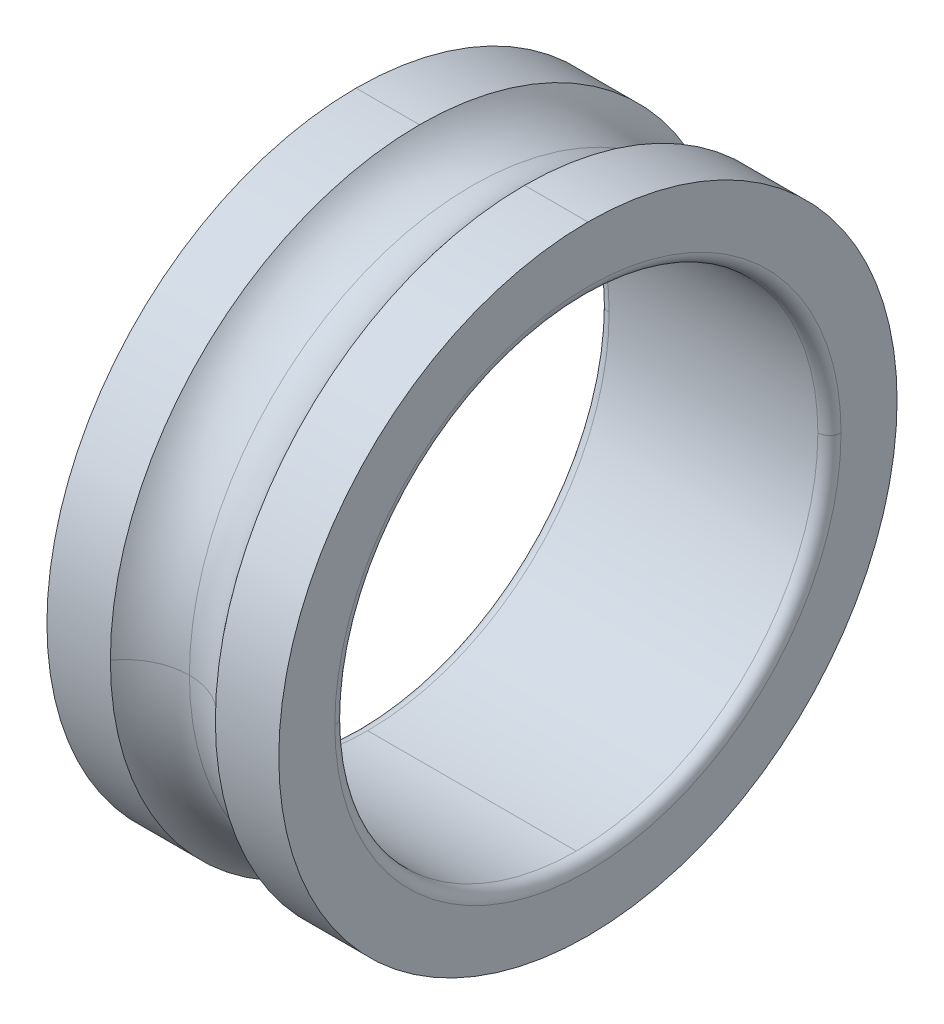
ISO-10303-21;
HEADER;
FILE_DESCRIPTION(('STEP AP214'),'2;1');
FILE_NAME('part.step','',(''),(''),'','','');
FILE_SCHEMA(('AUTOMOTIVE_DESIGN { 1 0 10303 214 1 1 1 1 }'));
ENDSEC;
DATA;
#1=APPLICATION_CONTEXT('core data for automotive mechanical design processes');
#2=APPLICATION_PROTOCOL_DEFINITION('international standard','automotive_design',2000,#1);
#3=PRODUCT_CONTEXT('',#1,'mechanical');
#4=PRODUCT('Part','Part','',(#3));
#5=PRODUCT_RELATED_PRODUCT_CATEGORY('part','',(#4));
#6=PRODUCT_DEFINITION_FORMATION('','',#4);
#7=PRODUCT_DEFINITION_CONTEXT('part definition',#1,'design');
#8=PRODUCT_DEFINITION('design','',#6,#7);
#9=PRODUCT_DEFINITION_SHAPE('','',#8);
#10=(LENGTH_UNIT() NAMED_UNIT(*) SI_UNIT(.MILLI.,.METRE.));
#11=(NAMED_UNIT(*) PLANE_ANGLE_UNIT() SI_UNIT($,.RADIAN.));
#12=(NAMED_UNIT(*) SI_UNIT($,.STERADIAN.) SOLID_ANGLE_UNIT());
#13=UNCERTAINTY_MEASURE_WITH_UNIT(LENGTH_MEASURE(1.E-05),#10,'distance_accuracy_value','');
#14=(GEOMETRIC_REPRESENTATION_CONTEXT(3) GLOBAL_UNCERTAINTY_ASSIGNED_CONTEXT((#13)) GLOBAL_UNIT_ASSIGNED_CONTEXT((#10,
#11,#12)) REPRESENTATION_CONTEXT('',''));
#15=CARTESIAN_POINT('',(0.,0.,0.));
#16=DIRECTION('',(0.,0.,1.));
#17=DIRECTION('',(1.,0.,0.));
#18=AXIS2_PLACEMENT_3D('',#15,#16,#17);
#19=CARTESIAN_POINT('',(10.3583539901292,0.,0.));
#20=DIRECTION('',(1.,0.,0.));
#21=DIRECTION('',(0.,1.,0.));
#22=AXIS2_PLACEMENT_3D('',#19,#20,#21);
#23=CYLINDRICAL_SURFACE('',#22,16.);
#24=DIRECTION('',(1.,0.,0.));
#25=VECTOR('',#24,1.);
#26=CARTESIAN_POINT('',(10.3583539901292,16.,0.));
#27=LINE('',#26,#25);
#28=CARTESIAN_POINT('',(8.71670798025846,16.,0.));
#29=VERTEX_POINT('',#28);
#30=CARTESIAN_POINT('',(12.,16.,0.));
#31=VERTEX_POINT('',#30);
#32=EDGE_CURVE('E159',#29,#31,#27,.T.);
#33=ORIENTED_EDGE('',*,*,#32,.T.);
#34=CARTESIAN_POINT('',(12.,0.,0.));
#35=DIRECTION('',(1.,0.,0.));
#36=DIRECTION('',(0.,1.,0.));
#37=AXIS2_PLACEMENT_3D('',#34,#35,#36);
#38=CIRCLE('',#37,16.);
#39=CARTESIAN_POINT('',(12.,-16.,0.));
#40=VERTEX_POINT('',#39);
#41=EDGE_CURVE('E167',#40,#31,#38,.T.);
#42=ORIENTED_EDGE('',*,*,#41,.F.);
#43=DIRECTION('',(-1.,0.,0.));
#44=VECTOR('',#43,1.);
#45=CARTESIAN_POINT('',(10.3583539901292,-16.,0.));
#46=LINE('',#45,#44);
#47=CARTESIAN_POINT('',(8.71670798025846,-16.,0.));
#48=VERTEX_POINT('',#47);
#49=EDGE_CURVE('E165',#40,#48,#46,.T.);
#50=ORIENTED_EDGE('',*,*,#49,.T.);
#51=CARTESIAN_POINT('',(8.71670798025846,0.,0.));
#52=DIRECTION('',(1.,0.,0.));
#53=DIRECTION('',(0.,1.,0.));
#54=AXIS2_PLACEMENT_3D('',#51,#52,#53);
#55=CIRCLE('',#54,16.);
#56=CARTESIAN_POINT('',(8.71670798025846,0.,-16.));
#57=VERTEX_POINT('',#56);
#58=EDGE_CURVE('E135',#48,#57,#55,.T.);
#59=ORIENTED_EDGE('',*,*,#58,.T.);
#60=CARTESIAN_POINT('',(8.71670798025846,0.,0.));
#61=DIRECTION('',(1.,0.,0.));
#62=DIRECTION('',(0.,1.,0.));
#63=AXIS2_PLACEMENT_3D('',#60,#61,#62);
#64=CIRCLE('',#63,16.);
#65=EDGE_CURVE('E157',#57,#29,#64,.T.);
#66=ORIENTED_EDGE('',*,*,#65,.T.);
#67=EDGE_LOOP('',(#33,#42,#50,#59,#66));
#68=FACE_BOUND('',#67,.T.);
#69=ADVANCED_FACE('F19',(#68),#23,.T.);
#70=CARTESIAN_POINT('',(6.,0.,0.));
#71=DIRECTION('',(1.,0.,0.));
#72=DIRECTION('',(0.,0.,-1.));
#73=AXIS2_PLACEMENT_3D('',#70,#71,#72);
#74=TOROIDAL_SURFACE('',#73,18.,3.3735);
#75=CARTESIAN_POINT('',(6.,0.,0.));
#76=DIRECTION('',(-1.,0.,0.));
#77=DIRECTION('',(0.,0.,1.));
#78=AXIS2_PLACEMENT_3D('',#75,#76,#77);
#79=CIRCLE('',#78,14.6265);
#80=CARTESIAN_POINT('',(6.,0.,14.6265));
#81=VERTEX_POINT('',#80);
#82=CARTESIAN_POINT('',(6.,0.,-14.6265));
#83=VERTEX_POINT('',#82);
#84=EDGE_CURVE('E117',#81,#83,#79,.T.);
#85=ORIENTED_EDGE('',*,*,#84,.T.);
#86=CARTESIAN_POINT('',(6.,0.,-18.));
#87=DIRECTION('',(0.,-1.,0.));
#88=DIRECTION('',(0.,0.,-1.));
#89=AXIS2_PLACEMENT_3D('',#86,#87,#88);
#90=CIRCLE('',#89,3.3735);
#91=CARTESIAN_POINT('',(3.28329201974154,0.,-16.));
#92=VERTEX_POINT('',#91);
#93=EDGE_CURVE('E131',#83,#92,#90,.T.);
#94=ORIENTED_EDGE('',*,*,#93,.T.);
#95=CARTESIAN_POINT('',(3.28329201974154,0.,0.));
#96=DIRECTION('',(1.,0.,0.));
#97=DIRECTION('',(0.,1.,0.));
#98=AXIS2_PLACEMENT_3D('',#95,#96,#97);
#99=CIRCLE('',#98,16.);
#100=CARTESIAN_POINT('',(3.28329201974154,16.,0.));
#101=VERTEX_POINT('',#100);
#102=EDGE_CURVE('E11',#92,#101,#99,.T.);
#103=ORIENTED_EDGE('',*,*,#102,.T.);
#104=CARTESIAN_POINT('',(3.28329201974154,0.,0.));
#105=DIRECTION('',(1.,0.,0.));
#106=DIRECTION('',(0.,1.,0.));
#107=AXIS2_PLACEMENT_3D('',#104,#105,#106);
#108=CIRCLE('',#107,16.);
#109=CARTESIAN_POINT('',(3.28329201974154,0.,16.));
#110=VERTEX_POINT('',#109);
#111=EDGE_CURVE('E119',#101,#110,#108,.T.);
#112=ORIENTED_EDGE('',*,*,#111,.T.);
#113=CARTESIAN_POINT('',(6.,0.,18.));
#114=DIRECTION('',(0.,-1.,0.));
#115=DIRECTION('',(0.,0.,1.));
#116=AXIS2_PLACEMENT_3D('',#113,#114,#115);
#117=CIRCLE('',#116,3.3735);
#118=EDGE_CURVE('E112',#110,#81,#117,.T.);
#119=ORIENTED_EDGE('',*,*,#118,.T.);
#120=EDGE_LOOP('',(#85,#94,#103,#112,#119));
#121=FACE_BOUND('',#120,.T.);
#122=ADVANCED_FACE('F114',(#121),#74,.F.);
#123=CARTESIAN_POINT('',(1.64164600987077,0.,0.));
#124=DIRECTION('',(1.,0.,0.));
#125=DIRECTION('',(0.,1.,0.));
#126=AXIS2_PLACEMENT_3D('',#123,#124,#125);
#127=CYLINDRICAL_SURFACE('',#126,16.);
#128=DIRECTION('',(1.,0.,0.));
#129=VECTOR('',#128,1.);
#130=CARTESIAN_POINT('',(1.64164600987077,16.,0.));
#131=LINE('',#130,#129);
#132=CARTESIAN_POINT('',(0.,16.,0.));
#133=VERTEX_POINT('',#132);
#134=EDGE_CURVE('E177',#133,#101,#131,.T.);
#135=ORIENTED_EDGE('',*,*,#134,.T.);
#136=ORIENTED_EDGE('',*,*,#102,.F.);
#137=CARTESIAN_POINT('',(3.28329201974154,0.,0.));
#138=DIRECTION('',(1.,0.,0.));
#139=DIRECTION('',(0.,1.,0.));
#140=AXIS2_PLACEMENT_3D('',#137,#138,#139);
#141=CIRCLE('',#140,16.);
#142=CARTESIAN_POINT('',(3.28329201974154,-16.,0.));
#143=VERTEX_POINT('',#142);
#144=EDGE_CURVE('E174',#143,#92,#141,.T.);
#145=ORIENTED_EDGE('',*,*,#144,.F.);
#146=DIRECTION('',(-1.,0.,0.));
#147=VECTOR('',#146,1.);
#148=CARTESIAN_POINT('',(1.64164600987077,-16.,0.));
#149=LINE('',#148,#147);
#150=CARTESIAN_POINT('',(0.,-16.,0.));
#151=VERTEX_POINT('',#150);
#152=EDGE_CURVE('E183',#143,#151,#149,.T.);
#153=ORIENTED_EDGE('',*,*,#152,.T.);
#154=CARTESIAN_POINT('',(0.,0.,0.));
#155=DIRECTION('',(1.,0.,0.));
#156=DIRECTION('',(0.,1.,0.));
#157=AXIS2_PLACEMENT_3D('',#154,#155,#156);
#158=CIRCLE('',#157,16.);
#159=EDGE_CURVE('E26',#151,#133,#158,.T.);
#160=ORIENTED_EDGE('',*,*,#159,.T.);
#161=EDGE_LOOP('',(#135,#136,#145,#153,#160));
#162=FACE_BOUND('',#161,.T.);
#163=ADVANCED_FACE('F227',(#162),#127,.T.);
#164=CARTESIAN_POINT('',(0.,14.55,0.));
#165=DIRECTION('',(-1.,0.,0.));
#166=DIRECTION('',(0.,0.,1.));
#167=AXIS2_PLACEMENT_3D('',#164,#165,#166);
#168=PLANE('',#167);
#169=CARTESIAN_POINT('',(0.,0.,0.));
#170=DIRECTION('',(1.,0.,0.));
#171=DIRECTION('',(0.,1.,0.));
#172=AXIS2_PLACEMENT_3D('',#169,#170,#171);
#173=CIRCLE('',#172,13.1);
#174=CARTESIAN_POINT('',(0.,0.,13.1));
#175=VERTEX_POINT('',#174);
#176=CARTESIAN_POINT('',(0.,0.,-13.1));
#177=VERTEX_POINT('',#176);
#178=EDGE_CURVE('E224',#175,#177,#173,.T.);
#179=ORIENTED_EDGE('',*,*,#178,.T.);
#180=CARTESIAN_POINT('',(0.,0.,0.));
#181=DIRECTION('',(1.,0.,0.));
#182=DIRECTION('',(0.,1.,0.));
#183=AXIS2_PLACEMENT_3D('',#180,#181,#182);
#184=CIRCLE('',#183,13.1);
#185=EDGE_CURVE('E199',#177,#175,#184,.T.);
#186=ORIENTED_EDGE('',*,*,#185,.T.);
#187=EDGE_LOOP('',(#179,#186));
#188=FACE_BOUND('',#187,.T.);
#189=CARTESIAN_POINT('',(0.,0.,0.));
#190=DIRECTION('',(1.,0.,0.));
#191=DIRECTION('',(0.,1.,0.));
#192=AXIS2_PLACEMENT_3D('',#189,#190,#191);
#193=CIRCLE('',#192,16.);
#194=EDGE_CURVE('E180',#133,#151,#193,.T.);
#195=ORIENTED_EDGE('',*,*,#194,.F.);
#196=ORIENTED_EDGE('',*,*,#159,.F.);
#197=EDGE_LOOP('',(#195,#196));
#198=FACE_BOUND('',#197,.T.);
#199=ADVANCED_FACE('F231',(#188,#198),#168,.T.);
#200=CARTESIAN_POINT('',(0.6,0.,0.));
#201=DIRECTION('',(1.,0.,0.));
#202=DIRECTION('',(0.,0.,-1.));
#203=AXIS2_PLACEMENT_3D('',#200,#201,#202);
#204=TOROIDAL_SURFACE('',#203,13.1,0.6);
#205=CARTESIAN_POINT('',(0.6,0.,-13.1));
#206=DIRECTION('',(0.,-1.,0.));
#207=DIRECTION('',(0.,0.,-1.));
#208=AXIS2_PLACEMENT_3D('',#205,#206,#207);
#209=CIRCLE('',#208,0.6);
#210=CARTESIAN_POINT('',(0.6,0.,-12.5));
#211=VERTEX_POINT('',#210);
#212=EDGE_CURVE('E187',#211,#177,#209,.T.);
#213=ORIENTED_EDGE('',*,*,#212,.T.);
#214=ORIENTED_EDGE('',*,*,#178,.F.);
#215=CARTESIAN_POINT('',(0.6,0.,13.1));
#216=DIRECTION('',(0.,-1.,0.));
#217=DIRECTION('',(0.,0.,1.));
#218=AXIS2_PLACEMENT_3D('',#215,#216,#217);
#219=CIRCLE('',#218,0.6);
#220=CARTESIAN_POINT('',(0.6,0.,12.5));
#221=VERTEX_POINT('',#220);
#222=EDGE_CURVE('E196',#175,#221,#219,.T.);
#223=ORIENTED_EDGE('',*,*,#222,.T.);
#224=CARTESIAN_POINT('',(0.6,0.,0.));
#225=DIRECTION('',(1.,0.,0.));
#226=DIRECTION('',(0.,1.,0.));
#227=AXIS2_PLACEMENT_3D('',#224,#225,#226);
#228=CIRCLE('',#227,12.5);
#229=CARTESIAN_POINT('',(0.6,-12.5,0.));
#230=VERTEX_POINT('',#229);
#231=EDGE_CURVE('E163',#221,#230,#228,.T.);
#232=ORIENTED_EDGE('',*,*,#231,.T.);
#233=CARTESIAN_POINT('',(0.6,0.,0.));
#234=DIRECTION('',(1.,0.,0.));
#235=DIRECTION('',(0.,1.,0.));
#236=AXIS2_PLACEMENT_3D('',#233,#234,#235);
#237=CIRCLE('',#236,12.5);
#238=EDGE_CURVE('E205',#230,#211,#237,.T.);
#239=ORIENTED_EDGE('',*,*,#238,.T.);
#240=EDGE_LOOP('',(#213,#214,#223,#232,#239));
#241=FACE_BOUND('',#240,.T.);
#242=ADVANCED_FACE('F274',(#241),#204,.T.);
#243=CARTESIAN_POINT('',(6.,0.,0.));
#244=DIRECTION('',(1.,0.,0.));
#245=DIRECTION('',(0.,1.,0.));
#246=AXIS2_PLACEMENT_3D('',#243,#244,#245);
#247=CYLINDRICAL_SURFACE('',#246,12.5);
#248=DIRECTION('',(1.,0.,0.));
#249=VECTOR('',#248,1.);
#250=CARTESIAN_POINT('',(6.,12.5,0.));
#251=LINE('',#250,#249);
#252=CARTESIAN_POINT('',(0.6,12.5,0.));
#253=VERTEX_POINT('',#252);
#254=CARTESIAN_POINT('',(11.4,12.5,0.));
#255=VERTEX_POINT('',#254);
#256=EDGE_CURVE('E202',#253,#255,#251,.T.);
#257=ORIENTED_EDGE('',*,*,#256,.T.);
#258=CARTESIAN_POINT('',(11.4,0.,0.));
#259=DIRECTION('',(1.,0.,0.));
#260=DIRECTION('',(0.,1.,0.));
#261=AXIS2_PLACEMENT_3D('',#258,#259,#260);
#262=CIRCLE('',#261,12.5);
#263=CARTESIAN_POINT('',(11.4,0.,12.5));
#264=VERTEX_POINT('',#263);
#265=EDGE_CURVE('E220',#255,#264,#262,.T.);
#266=ORIENTED_EDGE('',*,*,#265,.T.);
#267=CARTESIAN_POINT('',(11.4,0.,0.));
#268=DIRECTION('',(1.,0.,0.));
#269=DIRECTION('',(0.,1.,0.));
#270=AXIS2_PLACEMENT_3D('',#267,#268,#269);
#271=CIRCLE('',#270,12.5);
#272=CARTESIAN_POINT('',(11.4,-12.5,0.));
#273=VERTEX_POINT('',#272);
#274=EDGE_CURVE('E33',#264,#273,#271,.T.);
#275=ORIENTED_EDGE('',*,*,#274,.T.);
#276=DIRECTION('',(-1.,0.,0.));
#277=VECTOR('',#276,1.);
#278=CARTESIAN_POINT('',(6.,-12.5,0.));
#279=LINE('',#278,#277);
#280=EDGE_CURVE('E153',#273,#230,#279,.T.);
#281=ORIENTED_EDGE('',*,*,#280,.T.);
#282=ORIENTED_EDGE('',*,*,#231,.F.);
#283=CARTESIAN_POINT('',(0.6,0.,0.));
#284=DIRECTION('',(1.,0.,0.));
#285=DIRECTION('',(0.,1.,0.));
#286=AXIS2_PLACEMENT_3D('',#283,#284,#285);
#287=CIRCLE('',#286,12.5);
#288=EDGE_CURVE('E193',#253,#221,#287,.T.);
#289=ORIENTED_EDGE('',*,*,#288,.F.);
#290=EDGE_LOOP('',(#257,#266,#275,#281,#282,#289));
#291=FACE_BOUND('',#290,.T.);
#292=ADVANCED_FACE('F269',(#291),#247,.F.);
#293=CARTESIAN_POINT('',(11.4,0.,0.));
#294=DIRECTION('',(1.,0.,0.));
#295=DIRECTION('',(0.,0.,-1.));
#296=AXIS2_PLACEMENT_3D('',#293,#294,#295);
#297=TOROIDAL_SURFACE('',#296,13.1,0.6);
#298=CARTESIAN_POINT('',(11.4,0.,-13.1));
#299=DIRECTION('',(0.,-1.,0.));
#300=DIRECTION('',(0.,0.,-1.));
#301=AXIS2_PLACEMENT_3D('',#298,#299,#300);
#302=CIRCLE('',#301,0.6);
#303=CARTESIAN_POINT('',(12.,0.,-13.1));
#304=VERTEX_POINT('',#303);
#305=CARTESIAN_POINT('',(11.4,0.,-12.5));
#306=VERTEX_POINT('',#305);
#307=EDGE_CURVE('E213',#304,#306,#302,.T.);
#308=ORIENTED_EDGE('',*,*,#307,.T.);
#309=CARTESIAN_POINT('',(11.4,0.,0.));
#310=DIRECTION('',(1.,0.,0.));
#311=DIRECTION('',(0.,1.,0.));
#312=AXIS2_PLACEMENT_3D('',#309,#310,#311);
#313=CIRCLE('',#312,12.5);
#314=EDGE_CURVE('E207',#273,#306,#313,.T.);
#315=ORIENTED_EDGE('',*,*,#314,.F.);
#316=ORIENTED_EDGE('',*,*,#274,.F.);
#317=CARTESIAN_POINT('',(11.4,0.,13.1));
#318=DIRECTION('',(0.,-1.,0.));
#319=DIRECTION('',(0.,0.,1.));
#320=AXIS2_PLACEMENT_3D('',#317,#318,#319);
#321=CIRCLE('',#320,0.6);
#322=CARTESIAN_POINT('',(12.,0.,13.1));
#323=VERTEX_POINT('',#322);
#324=EDGE_CURVE('E218',#264,#323,#321,.T.);
#325=ORIENTED_EDGE('',*,*,#324,.T.);
#326=CARTESIAN_POINT('',(12.,0.,0.));
#327=DIRECTION('',(1.,0.,0.));
#328=DIRECTION('',(0.,1.,0.));
#329=AXIS2_PLACEMENT_3D('',#326,#327,#328);
#330=CIRCLE('',#329,13.1);
#331=EDGE_CURVE('E40',#323,#304,#330,.T.);
#332=ORIENTED_EDGE('',*,*,#331,.T.);
#333=EDGE_LOOP('',(#308,#315,#316,#325,#332));
#334=FACE_BOUND('',#333,.T.);
#335=ADVANCED_FACE('F261',(#334),#297,.T.);
#336=CARTESIAN_POINT('',(12.,14.55,0.));
#337=DIRECTION('',(1.,0.,0.));
#338=DIRECTION('',(0.,1.,0.));
#339=AXIS2_PLACEMENT_3D('',#336,#337,#338);
#340=PLANE('',#339);
#341=CARTESIAN_POINT('',(12.,0.,0.));
#342=DIRECTION('',(1.,0.,0.));
#343=DIRECTION('',(0.,1.,0.));
#344=AXIS2_PLACEMENT_3D('',#341,#342,#343);
#345=CIRCLE('',#344,13.1);
#346=EDGE_CURVE('E215',#304,#323,#345,.T.);
#347=ORIENTED_EDGE('',*,*,#346,.F.);
#348=ORIENTED_EDGE('',*,*,#331,.F.);
#349=EDGE_LOOP('',(#347,#348));
#350=FACE_BOUND('',#349,.T.);
#351=CARTESIAN_POINT('',(12.,0.,0.));
#352=DIRECTION('',(1.,0.,0.));
#353=DIRECTION('',(0.,1.,0.));
#354=AXIS2_PLACEMENT_3D('',#351,#352,#353);
#355=CIRCLE('',#354,16.);
#356=EDGE_CURVE('E124',#31,#40,#355,.T.);
#357=ORIENTED_EDGE('',*,*,#356,.T.);
#358=ORIENTED_EDGE('',*,*,#41,.T.);
#359=EDGE_LOOP('',(#357,#358));
#360=FACE_BOUND('',#359,.T.);
#361=ADVANCED_FACE('F258',(#350,#360),#340,.T.);
#362=CARTESIAN_POINT('',(11.4,0.,0.));
#363=DIRECTION('',(1.,0.,0.));
#364=DIRECTION('',(0.,0.,-1.));
#365=AXIS2_PLACEMENT_3D('',#362,#363,#364);
#366=TOROIDAL_SURFACE('',#365,13.1,0.6);
#367=ORIENTED_EDGE('',*,*,#307,.F.);
#368=ORIENTED_EDGE('',*,*,#346,.T.);
#369=ORIENTED_EDGE('',*,*,#324,.F.);
#370=ORIENTED_EDGE('',*,*,#265,.F.);
#371=CARTESIAN_POINT('',(11.4,0.,0.));
#372=DIRECTION('',(1.,0.,0.));
#373=DIRECTION('',(0.,1.,0.));
#374=AXIS2_PLACEMENT_3D('',#371,#372,#373);
#375=CIRCLE('',#374,12.5);
#376=EDGE_CURVE('E210',#306,#255,#375,.T.);
#377=ORIENTED_EDGE('',*,*,#376,.F.);
#378=EDGE_LOOP('',(#367,#368,#369,#370,#377));
#379=FACE_BOUND('',#378,.T.);
#380=ADVANCED_FACE('F260',(#379),#366,.T.);
#381=CARTESIAN_POINT('',(6.,0.,0.));
#382=DIRECTION('',(1.,0.,0.));
#383=DIRECTION('',(0.,1.,0.));
#384=AXIS2_PLACEMENT_3D('',#381,#382,#383);
#385=CYLINDRICAL_SURFACE('',#384,12.5);
#386=ORIENTED_EDGE('',*,*,#256,.F.);
#387=CARTESIAN_POINT('',(0.6,0.,0.));
#388=DIRECTION('',(1.,0.,0.));
#389=DIRECTION('',(0.,1.,0.));
#390=AXIS2_PLACEMENT_3D('',#387,#388,#389);
#391=CIRCLE('',#390,12.5);
#392=EDGE_CURVE('E190',#211,#253,#391,.T.);
#393=ORIENTED_EDGE('',*,*,#392,.F.);
#394=ORIENTED_EDGE('',*,*,#238,.F.);
#395=ORIENTED_EDGE('',*,*,#280,.F.);
#396=ORIENTED_EDGE('',*,*,#314,.T.);
#397=ORIENTED_EDGE('',*,*,#376,.T.);
#398=EDGE_LOOP('',(#386,#393,#394,#395,#396,#397));
#399=FACE_BOUND('',#398,.T.);
#400=ADVANCED_FACE('F244',(#399),#385,.F.);
#401=CARTESIAN_POINT('',(0.6,0.,0.));
#402=DIRECTION('',(1.,0.,0.));
#403=DIRECTION('',(0.,0.,-1.));
#404=AXIS2_PLACEMENT_3D('',#401,#402,#403);
#405=TOROIDAL_SURFACE('',#404,13.1,0.6);
#406=ORIENTED_EDGE('',*,*,#212,.F.);
#407=ORIENTED_EDGE('',*,*,#392,.T.);
#408=ORIENTED_EDGE('',*,*,#288,.T.);
#409=ORIENTED_EDGE('',*,*,#222,.F.);
#410=ORIENTED_EDGE('',*,*,#185,.F.);
#411=EDGE_LOOP('',(#406,#407,#408,#409,#410));
#412=FACE_BOUND('',#411,.T.);
#413=ADVANCED_FACE('F235',(#412),#405,.T.);
#414=CARTESIAN_POINT('',(1.64164600987077,0.,0.));
#415=DIRECTION('',(1.,0.,0.));
#416=DIRECTION('',(0.,1.,0.));
#417=AXIS2_PLACEMENT_3D('',#414,#415,#416);
#418=CYLINDRICAL_SURFACE('',#417,16.);
#419=ORIENTED_EDGE('',*,*,#134,.F.);
#420=ORIENTED_EDGE('',*,*,#194,.T.);
#421=ORIENTED_EDGE('',*,*,#152,.F.);
#422=CARTESIAN_POINT('',(3.28329201974154,0.,0.));
#423=DIRECTION('',(1.,0.,0.));
#424=DIRECTION('',(0.,1.,0.));
#425=AXIS2_PLACEMENT_3D('',#422,#423,#424);
#426=CIRCLE('',#425,16.);
#427=EDGE_CURVE('E123',#110,#143,#426,.T.);
#428=ORIENTED_EDGE('',*,*,#427,.F.);
#429=ORIENTED_EDGE('',*,*,#111,.F.);
#430=EDGE_LOOP('',(#419,#420,#421,#428,#429));
#431=FACE_BOUND('',#430,.T.);
#432=ADVANCED_FACE('F233',(#431),#418,.T.);
#433=CARTESIAN_POINT('',(6.,0.,0.));
#434=DIRECTION('',(1.,0.,0.));
#435=DIRECTION('',(0.,0.,-1.));
#436=AXIS2_PLACEMENT_3D('',#433,#434,#435);
#437=TOROIDAL_SURFACE('',#436,18.,3.3735);
#438=CARTESIAN_POINT('',(6.,0.,0.));
#439=DIRECTION('',(-1.,0.,0.));
#440=DIRECTION('',(0.,0.,1.));
#441=AXIS2_PLACEMENT_3D('',#438,#439,#440);
#442=CIRCLE('',#441,14.6265);
#443=EDGE_CURVE('E127',#83,#81,#442,.T.);
#444=ORIENTED_EDGE('',*,*,#443,.T.);
#445=ORIENTED_EDGE('',*,*,#118,.F.);
#446=ORIENTED_EDGE('',*,*,#427,.T.);
#447=ORIENTED_EDGE('',*,*,#144,.T.);
#448=ORIENTED_EDGE('',*,*,#93,.F.);
#449=EDGE_LOOP('',(#444,#445,#446,#447,#448));
#450=FACE_BOUND('',#449,.T.);
#451=ADVANCED_FACE('F129',(#450),#437,.F.);
#452=CARTESIAN_POINT('',(10.3583539901292,0.,0.));
#453=DIRECTION('',(1.,0.,0.));
#454=DIRECTION('',(0.,1.,0.));
#455=AXIS2_PLACEMENT_3D('',#452,#453,#454);
#456=CYLINDRICAL_SURFACE('',#455,16.);
#457=ORIENTED_EDGE('',*,*,#32,.F.);
#458=CARTESIAN_POINT('',(8.71670798025846,0.,0.));
#459=DIRECTION('',(1.,0.,0.));
#460=DIRECTION('',(0.,1.,0.));
#461=AXIS2_PLACEMENT_3D('',#458,#459,#460);
#462=CIRCLE('',#461,16.);
#463=CARTESIAN_POINT('',(8.71670798025846,0.,16.));
#464=VERTEX_POINT('',#463);
#465=EDGE_CURVE('E147',#29,#464,#462,.T.);
#466=ORIENTED_EDGE('',*,*,#465,.T.);
#467=CARTESIAN_POINT('',(8.71670798025846,0.,0.));
#468=DIRECTION('',(1.,0.,0.));
#469=DIRECTION('',(0.,1.,0.));
#470=AXIS2_PLACEMENT_3D('',#467,#468,#469);
#471=CIRCLE('',#470,16.);
#472=EDGE_CURVE('E143',#464,#48,#471,.T.);
#473=ORIENTED_EDGE('',*,*,#472,.T.);
#474=ORIENTED_EDGE('',*,*,#49,.F.);
#475=ORIENTED_EDGE('',*,*,#356,.F.);
#476=EDGE_LOOP('',(#457,#466,#473,#474,#475));
#477=FACE_BOUND('',#476,.T.);
#478=ADVANCED_FACE('F242',(#477),#456,.T.);
#479=CARTESIAN_POINT('',(6.,0.,0.));
#480=DIRECTION('',(1.,0.,0.));
#481=DIRECTION('',(0.,0.,-1.));
#482=AXIS2_PLACEMENT_3D('',#479,#480,#481);
#483=TOROIDAL_SURFACE('',#482,18.,3.3735);
#484=ORIENTED_EDGE('',*,*,#443,.F.);
#485=CARTESIAN_POINT('',(6.,0.,-18.));
#486=DIRECTION('',(0.,-1.,0.));
#487=DIRECTION('',(0.,0.,-1.));
#488=AXIS2_PLACEMENT_3D('',#485,#486,#487);
#489=CIRCLE('',#488,3.3735);
#490=EDGE_CURVE('E136',#57,#83,#489,.T.);
#491=ORIENTED_EDGE('',*,*,#490,.F.);
#492=ORIENTED_EDGE('',*,*,#58,.F.);
#493=ORIENTED_EDGE('',*,*,#472,.F.);
#494=CARTESIAN_POINT('',(6.,0.,18.));
#495=DIRECTION('',(0.,-1.,0.));
#496=DIRECTION('',(0.,0.,1.));
#497=AXIS2_PLACEMENT_3D('',#494,#495,#496);
#498=CIRCLE('',#497,3.3735);
#499=EDGE_CURVE('E139',#81,#464,#498,.T.);
#500=ORIENTED_EDGE('',*,*,#499,.F.);
#501=EDGE_LOOP('',(#484,#491,#492,#493,#500));
#502=FACE_BOUND('',#501,.T.);
#503=ADVANCED_FACE('F140',(#502),#483,.F.);
#504=CARTESIAN_POINT('',(6.,0.,0.));
#505=DIRECTION('',(1.,0.,0.));
#506=DIRECTION('',(0.,0.,-1.));
#507=AXIS2_PLACEMENT_3D('',#504,#505,#506);
#508=TOROIDAL_SURFACE('',#507,18.,3.3735);
#509=ORIENTED_EDGE('',*,*,#84,.F.);
#510=ORIENTED_EDGE('',*,*,#499,.T.);
#511=ORIENTED_EDGE('',*,*,#465,.F.);
#512=ORIENTED_EDGE('',*,*,#65,.F.);
#513=ORIENTED_EDGE('',*,*,#490,.T.);
#514=EDGE_LOOP('',(#509,#510,#511,#512,#513));
#515=FACE_BOUND('',#514,.T.);
#516=ADVANCED_FACE('F149',(#515),#508,.F.);
#517=CLOSED_SHELL('',(#69,#122,#163,#199,#242,#292,#335,#361,#380,#400,#413,#432,#451,#478,#503,#516));
#518=MANIFOLD_SOLID_BREP('B1',#517);
#519=ADVANCED_BREP_SHAPE_REPRESENTATION('',(#18,#518),#14);
#520=SHAPE_DEFINITION_REPRESENTATION(#9,#519);
ENDSEC;
END-ISO-10303-21;
